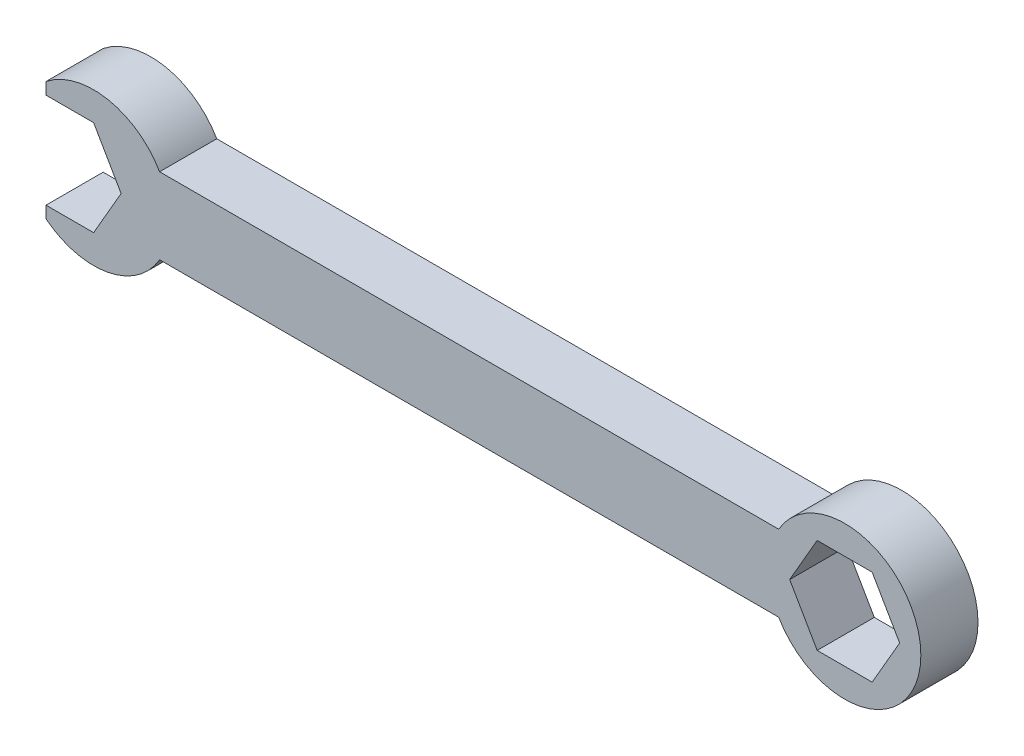
ISO-10303-21;
HEADER;
FILE_DESCRIPTION(('STEP AP214'),'2;1');
FILE_NAME('part.step','',(''),(''),'','','');
FILE_SCHEMA(('AUTOMOTIVE_DESIGN { 1 0 10303 214 1 1 1 1 }'));
ENDSEC;
DATA;
#1=APPLICATION_CONTEXT('core data for automotive mechanical design processes');
#2=APPLICATION_PROTOCOL_DEFINITION('international standard','automotive_design',2000,#1);
#3=PRODUCT_CONTEXT('',#1,'mechanical');
#4=PRODUCT('Part','Part','',(#3));
#5=PRODUCT_RELATED_PRODUCT_CATEGORY('part','',(#4));
#6=PRODUCT_DEFINITION_FORMATION('','',#4);
#7=PRODUCT_DEFINITION_CONTEXT('part definition',#1,'design');
#8=PRODUCT_DEFINITION('design','',#6,#7);
#9=PRODUCT_DEFINITION_SHAPE('','',#8);
#10=(LENGTH_UNIT() NAMED_UNIT(*) SI_UNIT(.MILLI.,.METRE.));
#11=(NAMED_UNIT(*) PLANE_ANGLE_UNIT() SI_UNIT($,.RADIAN.));
#12=(NAMED_UNIT(*) SI_UNIT($,.STERADIAN.) SOLID_ANGLE_UNIT());
#13=UNCERTAINTY_MEASURE_WITH_UNIT(LENGTH_MEASURE(1.E-05),#10,'distance_accuracy_value','');
#14=(GEOMETRIC_REPRESENTATION_CONTEXT(3) GLOBAL_UNCERTAINTY_ASSIGNED_CONTEXT((#13)) GLOBAL_UNIT_ASSIGNED_CONTEXT((#10,
#11,#12)) REPRESENTATION_CONTEXT('',''));
#15=CARTESIAN_POINT('',(0.,0.,0.));
#16=DIRECTION('',(0.,0.,1.));
#17=DIRECTION('',(1.,0.,0.));
#18=AXIS2_PLACEMENT_3D('',#15,#16,#17);
#19=CARTESIAN_POINT('',(77.8603578106905,-44.9526985412027,7.62));
#20=DIRECTION('',(-0.866025403784439,0.5,0.));
#21=DIRECTION('',(-0.5,-0.866025403784439,0.));
#22=AXIS2_PLACEMENT_3D('',#19,#20,#21);
#23=PLANE('',#22);
#24=DIRECTION('',(0.5,0.866025403784439,0.));
#25=VECTOR('',#24,1.);
#26=CARTESIAN_POINT('',(77.8603578106905,-44.9526985412027,0.));
#27=LINE('',#26,#25);
#28=CARTESIAN_POINT('',(100.1476362049,-6.34999999999999,0.));
#29=VERTEX_POINT('',#28);
#30=CARTESIAN_POINT('',(103.813810414254,0.,0.));
#31=VERTEX_POINT('',#30);
#32=EDGE_CURVE('E224',#29,#31,#27,.T.);
#33=ORIENTED_EDGE('',*,*,#32,.F.);
#34=DIRECTION('',(0.,0.,-1.));
#35=VECTOR('',#34,1.);
#36=CARTESIAN_POINT('',(100.1476362049,-6.34999999999999,7.62));
#37=LINE('',#36,#35);
#38=CARTESIAN_POINT('',(100.1476362049,-6.34999999999999,7.62));
#39=VERTEX_POINT('',#38);
#40=EDGE_CURVE('E11',#39,#29,#37,.T.);
#41=ORIENTED_EDGE('',*,*,#40,.F.);
#42=DIRECTION('',(0.5,0.866025403784439,0.));
#43=VECTOR('',#42,1.);
#44=CARTESIAN_POINT('',(77.8603578106905,-44.9526985412027,7.62));
#45=LINE('',#44,#43);
#46=CARTESIAN_POINT('',(103.813810414254,0.,7.62));
#47=VERTEX_POINT('',#46);
#48=EDGE_CURVE('E315',#39,#47,#45,.T.);
#49=ORIENTED_EDGE('',*,*,#48,.T.);
#50=DIRECTION('',(0.,0.,-1.));
#51=VECTOR('',#50,1.);
#52=CARTESIAN_POINT('',(103.813810414254,0.,7.62));
#53=LINE('',#52,#51);
#54=EDGE_CURVE('E59',#47,#31,#53,.T.);
#55=ORIENTED_EDGE('',*,*,#54,.T.);
#56=EDGE_LOOP('',(#33,#41,#49,#55));
#57=FACE_BOUND('',#56,.T.);
#58=ADVANCED_FACE('F39',(#57),#23,.T.);
#59=CARTESIAN_POINT('',(0.,-6.35,7.62));
#60=DIRECTION('',(0.,1.,0.));
#61=DIRECTION('',(-1.,0.,0.));
#62=AXIS2_PLACEMENT_3D('',#59,#60,#61);
#63=PLANE('',#62);
#64=DIRECTION('',(1.,0.,0.));
#65=VECTOR('',#64,1.);
#66=CARTESIAN_POINT('',(0.,-6.35,0.));
#67=LINE('',#66,#65);
#68=CARTESIAN_POINT('',(92.8152877861916,-6.34999999999999,0.));
#69=VERTEX_POINT('',#68);
#70=EDGE_CURVE('E230',#69,#29,#67,.T.);
#71=ORIENTED_EDGE('',*,*,#70,.F.);
#72=DIRECTION('',(0.,0.,-1.));
#73=VECTOR('',#72,1.);
#74=CARTESIAN_POINT('',(92.8152877861916,-6.34999999999999,7.62));
#75=LINE('',#74,#73);
#76=CARTESIAN_POINT('',(92.8152877861916,-6.34999999999999,7.62));
#77=VERTEX_POINT('',#76);
#78=EDGE_CURVE('E47',#77,#69,#75,.T.);
#79=ORIENTED_EDGE('',*,*,#78,.F.);
#80=DIRECTION('',(1.,0.,0.));
#81=VECTOR('',#80,1.);
#82=CARTESIAN_POINT('',(0.,-6.35,7.62));
#83=LINE('',#82,#81);
#84=EDGE_CURVE('E312',#77,#39,#83,.T.);
#85=ORIENTED_EDGE('',*,*,#84,.T.);
#86=ORIENTED_EDGE('',*,*,#40,.T.);
#87=EDGE_LOOP('',(#71,#79,#85,#86));
#88=FACE_BOUND('',#87,.T.);
#89=ADVANCED_FACE('F335',(#88),#63,.T.);
#90=CARTESIAN_POINT('',(66.8618351826281,38.6026985412027,7.62));
#91=DIRECTION('',(0.866025403784439,0.499999999999999,0.));
#92=DIRECTION('',(-0.5,0.866025403784439,0.));
#93=AXIS2_PLACEMENT_3D('',#90,#91,#92);
#94=PLANE('',#93);
#95=DIRECTION('',(0.499999999999999,-0.866025403784439,0.));
#96=VECTOR('',#95,1.);
#97=CARTESIAN_POINT('',(66.8618351826281,38.6026985412027,0.));
#98=LINE('',#97,#96);
#99=CARTESIAN_POINT('',(89.1491135768375,0.,0.));
#100=VERTEX_POINT('',#99);
#101=EDGE_CURVE('E229',#100,#69,#98,.T.);
#102=ORIENTED_EDGE('',*,*,#101,.F.);
#103=DIRECTION('',(0.,0.,-1.));
#104=VECTOR('',#103,1.);
#105=CARTESIAN_POINT('',(89.1491135768375,0.,7.62));
#106=LINE('',#105,#104);
#107=CARTESIAN_POINT('',(89.1491135768375,0.,7.62));
#108=VERTEX_POINT('',#107);
#109=EDGE_CURVE('E172',#108,#100,#106,.T.);
#110=ORIENTED_EDGE('',*,*,#109,.F.);
#111=DIRECTION('',(0.499999999999999,-0.866025403784439,0.));
#112=VECTOR('',#111,1.);
#113=CARTESIAN_POINT('',(66.8618351826281,38.6026985412027,7.62));
#114=LINE('',#113,#112);
#115=EDGE_CURVE('E186',#108,#77,#114,.T.);
#116=ORIENTED_EDGE('',*,*,#115,.T.);
#117=ORIENTED_EDGE('',*,*,#78,.T.);
#118=EDGE_LOOP('',(#102,#110,#116,#117));
#119=FACE_BOUND('',#118,.T.);
#120=ADVANCED_FACE('F318',(#119),#94,.T.);
#121=CARTESIAN_POINT('',(66.8618351826281,-38.6026985412027,7.62));
#122=DIRECTION('',(0.866025403784439,-0.5,0.));
#123=DIRECTION('',(0.5,0.866025403784439,0.));
#124=AXIS2_PLACEMENT_3D('',#121,#122,#123);
#125=PLANE('',#124);
#126=DIRECTION('',(-0.5,-0.866025403784439,0.));
#127=VECTOR('',#126,1.);
#128=CARTESIAN_POINT('',(66.8618351826281,-38.6026985412027,0.));
#129=LINE('',#128,#127);
#130=CARTESIAN_POINT('',(92.8152877861915,6.35000000000001,0.));
#131=VERTEX_POINT('',#130);
#132=EDGE_CURVE('E173',#131,#100,#129,.T.);
#133=ORIENTED_EDGE('',*,*,#132,.F.);
#134=DIRECTION('',(0.,0.,-1.));
#135=VECTOR('',#134,1.);
#136=CARTESIAN_POINT('',(92.8152877861915,6.35000000000001,7.62));
#137=LINE('',#136,#135);
#138=CARTESIAN_POINT('',(92.8152877861915,6.35000000000001,7.62));
#139=VERTEX_POINT('',#138);
#140=EDGE_CURVE('E168',#139,#131,#137,.T.);
#141=ORIENTED_EDGE('',*,*,#140,.F.);
#142=DIRECTION('',(-0.5,-0.866025403784439,0.));
#143=VECTOR('',#142,1.);
#144=CARTESIAN_POINT('',(66.8618351826281,-38.6026985412027,7.62));
#145=LINE('',#144,#143);
#146=EDGE_CURVE('E170',#139,#108,#145,.T.);
#147=ORIENTED_EDGE('',*,*,#146,.T.);
#148=ORIENTED_EDGE('',*,*,#109,.T.);
#149=EDGE_LOOP('',(#133,#141,#147,#148));
#150=FACE_BOUND('',#149,.T.);
#151=ADVANCED_FACE('F166',(#150),#125,.T.);
#152=CARTESIAN_POINT('',(0.,6.35000000000001,7.62));
#153=DIRECTION('',(0.,-1.,0.));
#154=DIRECTION('',(0.,0.,-1.));
#155=AXIS2_PLACEMENT_3D('',#152,#153,#154);
#156=PLANE('',#155);
#157=DIRECTION('',(-1.,0.,0.));
#158=VECTOR('',#157,1.);
#159=CARTESIAN_POINT('',(0.,6.35000000000001,0.));
#160=LINE('',#159,#158);
#161=CARTESIAN_POINT('',(100.1476362049,6.35,0.));
#162=VERTEX_POINT('',#161);
#163=EDGE_CURVE('E233',#162,#131,#160,.T.);
#164=ORIENTED_EDGE('',*,*,#163,.F.);
#165=DIRECTION('',(0.,0.,-1.));
#166=VECTOR('',#165,1.);
#167=CARTESIAN_POINT('',(100.1476362049,6.35,7.62));
#168=LINE('',#167,#166);
#169=CARTESIAN_POINT('',(100.1476362049,6.35,7.62));
#170=VERTEX_POINT('',#169);
#171=EDGE_CURVE('E110',#170,#162,#168,.T.);
#172=ORIENTED_EDGE('',*,*,#171,.F.);
#173=DIRECTION('',(-1.,0.,0.));
#174=VECTOR('',#173,1.);
#175=CARTESIAN_POINT('',(0.,6.35000000000001,7.62));
#176=LINE('',#175,#174);
#177=EDGE_CURVE('E183',#170,#139,#176,.T.);
#178=ORIENTED_EDGE('',*,*,#177,.T.);
#179=ORIENTED_EDGE('',*,*,#140,.T.);
#180=EDGE_LOOP('',(#164,#172,#178,#179));
#181=FACE_BOUND('',#180,.T.);
#182=ADVANCED_FACE('F187',(#181),#156,.T.);
#183=CARTESIAN_POINT('',(0.,-5.08,7.62));
#184=DIRECTION('',(0.,1.,0.));
#185=DIRECTION('',(0.,0.,1.));
#186=AXIS2_PLACEMENT_3D('',#183,#184,#185);
#187=PLANE('',#186);
#188=DIRECTION('',(1.,0.,0.));
#189=VECTOR('',#188,1.);
#190=CARTESIAN_POINT('',(0.,-5.08,0.));
#191=LINE('',#190,#189);
#192=CARTESIAN_POINT('',(5.13264389309577,-5.08,0.));
#193=VERTEX_POINT('',#192);
#194=CARTESIAN_POINT('',(87.6826438930958,-5.08,0.));
#195=VERTEX_POINT('',#194);
#196=EDGE_CURVE('E193',#193,#195,#191,.T.);
#197=ORIENTED_EDGE('',*,*,#196,.T.);
#198=DIRECTION('',(0.,0.,-1.));
#199=VECTOR('',#198,1.);
#200=CARTESIAN_POINT('',(87.6826438930958,-5.08,7.62));
#201=LINE('',#200,#199);
#202=CARTESIAN_POINT('',(87.6826438930958,-5.08,7.62));
#203=VERTEX_POINT('',#202);
#204=EDGE_CURVE('E43',#203,#195,#201,.T.);
#205=ORIENTED_EDGE('',*,*,#204,.F.);
#206=DIRECTION('',(1.,0.,0.));
#207=VECTOR('',#206,1.);
#208=CARTESIAN_POINT('',(0.,-5.08,7.62));
#209=LINE('',#208,#207);
#210=CARTESIAN_POINT('',(5.13264389309577,-5.08,7.62));
#211=VERTEX_POINT('',#210);
#212=EDGE_CURVE('E236',#211,#203,#209,.T.);
#213=ORIENTED_EDGE('',*,*,#212,.F.);
#214=DIRECTION('',(0.,0.,-1.));
#215=VECTOR('',#214,1.);
#216=CARTESIAN_POINT('',(5.13264389309577,-5.08,7.62));
#217=LINE('',#216,#215);
#218=EDGE_CURVE('E192',#211,#193,#217,.T.);
#219=ORIENTED_EDGE('',*,*,#218,.T.);
#220=EDGE_LOOP('',(#197,#205,#213,#219));
#221=FACE_BOUND('',#220,.T.);
#222=ADVANCED_FACE('F41',(#221),#187,.F.);
#223=CARTESIAN_POINT('',(96.4814619955457,0.,7.62));
#224=DIRECTION('',(0.,0.,-1.));
#225=DIRECTION('',(-1.,0.,0.));
#226=AXIS2_PLACEMENT_3D('',#223,#224,#225);
#227=CYLINDRICAL_SURFACE('',#226,10.16);
#228=CARTESIAN_POINT('',(96.4814619955457,0.,0.));
#229=DIRECTION('',(0.,0.,1.));
#230=DIRECTION('',(1.,0.,0.));
#231=AXIS2_PLACEMENT_3D('',#228,#229,#230);
#232=CIRCLE('',#231,10.16);
#233=CARTESIAN_POINT('',(87.6826438930958,5.08,0.));
#234=VERTEX_POINT('',#233);
#235=EDGE_CURVE('E199',#195,#234,#232,.T.);
#236=ORIENTED_EDGE('',*,*,#235,.T.);
#237=DIRECTION('',(0.,0.,-1.));
#238=VECTOR('',#237,1.);
#239=CARTESIAN_POINT('',(87.6826438930958,5.08,7.62));
#240=LINE('',#239,#238);
#241=CARTESIAN_POINT('',(87.6826438930958,5.08,7.62));
#242=VERTEX_POINT('',#241);
#243=EDGE_CURVE('E265',#242,#234,#240,.T.);
#244=ORIENTED_EDGE('',*,*,#243,.F.);
#245=CARTESIAN_POINT('',(96.4814619955457,0.,7.62));
#246=DIRECTION('',(0.,0.,1.));
#247=DIRECTION('',(1.,0.,0.));
#248=AXIS2_PLACEMENT_3D('',#245,#246,#247);
#249=CIRCLE('',#248,10.16);
#250=EDGE_CURVE('E121',#203,#242,#249,.T.);
#251=ORIENTED_EDGE('',*,*,#250,.F.);
#252=ORIENTED_EDGE('',*,*,#204,.T.);
#253=EDGE_LOOP('',(#236,#244,#251,#252));
#254=FACE_BOUND('',#253,.T.);
#255=ADVANCED_FACE('F270',(#254),#227,.T.);
#256=CARTESIAN_POINT('',(0.,5.08,7.62));
#257=DIRECTION('',(0.,1.,0.));
#258=DIRECTION('',(0.,0.,1.));
#259=AXIS2_PLACEMENT_3D('',#256,#257,#258);
#260=PLANE('',#259);
#261=DIRECTION('',(1.,0.,0.));
#262=VECTOR('',#261,1.);
#263=CARTESIAN_POINT('',(0.,5.08,0.));
#264=LINE('',#263,#262);
#265=CARTESIAN_POINT('',(5.13264389309577,5.08,0.));
#266=VERTEX_POINT('',#265);
#267=EDGE_CURVE('E202',#266,#234,#264,.T.);
#268=ORIENTED_EDGE('',*,*,#267,.F.);
#269=DIRECTION('',(0.,0.,-1.));
#270=VECTOR('',#269,1.);
#271=CARTESIAN_POINT('',(5.13264389309577,5.08,7.62));
#272=LINE('',#271,#270);
#273=CARTESIAN_POINT('',(5.13264389309577,5.08,7.62));
#274=VERTEX_POINT('',#273);
#275=EDGE_CURVE('E263',#274,#266,#272,.T.);
#276=ORIENTED_EDGE('',*,*,#275,.F.);
#277=DIRECTION('',(1.,0.,0.));
#278=VECTOR('',#277,1.);
#279=CARTESIAN_POINT('',(0.,5.08,7.62));
#280=LINE('',#279,#278);
#281=EDGE_CURVE('E285',#274,#242,#280,.T.);
#282=ORIENTED_EDGE('',*,*,#281,.T.);
#283=ORIENTED_EDGE('',*,*,#243,.T.);
#284=EDGE_LOOP('',(#268,#276,#282,#283));
#285=FACE_BOUND('',#284,.T.);
#286=ADVANCED_FACE('F278',(#285),#260,.T.);
#287=CARTESIAN_POINT('',(-3.66617420935412,0.,7.62));
#288=DIRECTION('',(0.,0.,-1.));
#289=DIRECTION('',(-1.,0.,0.));
#290=AXIS2_PLACEMENT_3D('',#287,#288,#289);
#291=CYLINDRICAL_SURFACE('',#290,10.16);
#292=CARTESIAN_POINT('',(-3.66617420935412,0.,0.));
#293=DIRECTION('',(0.,0.,1.));
#294=DIRECTION('',(1.,0.,0.));
#295=AXIS2_PLACEMENT_3D('',#292,#293,#294);
#296=CIRCLE('',#295,10.16);
#297=CARTESIAN_POINT('',(-10.0161742093541,7.93114745796596,0.));
#298=VERTEX_POINT('',#297);
#299=EDGE_CURVE('E204',#266,#298,#296,.T.);
#300=ORIENTED_EDGE('',*,*,#299,.T.);
#301=DIRECTION('',(0.,0.,-1.));
#302=VECTOR('',#301,1.);
#303=CARTESIAN_POINT('',(-10.0161742093541,7.93114745796596,7.62));
#304=LINE('',#303,#302);
#305=CARTESIAN_POINT('',(-10.0161742093541,7.93114745796596,7.62));
#306=VERTEX_POINT('',#305);
#307=EDGE_CURVE('E256',#306,#298,#304,.T.);
#308=ORIENTED_EDGE('',*,*,#307,.F.);
#309=CARTESIAN_POINT('',(-3.66617420935412,0.,7.62));
#310=DIRECTION('',(0.,0.,1.));
#311=DIRECTION('',(1.,0.,0.));
#312=AXIS2_PLACEMENT_3D('',#309,#310,#311);
#313=CIRCLE('',#312,10.16);
#314=EDGE_CURVE('E283',#274,#306,#313,.T.);
#315=ORIENTED_EDGE('',*,*,#314,.F.);
#316=ORIENTED_EDGE('',*,*,#275,.T.);
#317=EDGE_LOOP('',(#300,#308,#315,#316));
#318=FACE_BOUND('',#317,.T.);
#319=ADVANCED_FACE('F286',(#318),#291,.T.);
#320=CARTESIAN_POINT('',(-10.0161742093541,0.,7.62));
#321=DIRECTION('',(1.,0.,0.));
#322=DIRECTION('',(0.,0.,-1.));
#323=AXIS2_PLACEMENT_3D('',#320,#321,#322);
#324=PLANE('',#323);
#325=DIRECTION('',(0.,-1.,0.));
#326=VECTOR('',#325,1.);
#327=CARTESIAN_POINT('',(-10.0161742093541,0.,0.));
#328=LINE('',#327,#326);
#329=CARTESIAN_POINT('',(-10.0161742093541,6.35,0.));
#330=VERTEX_POINT('',#329);
#331=EDGE_CURVE('E206',#298,#330,#328,.T.);
#332=ORIENTED_EDGE('',*,*,#331,.T.);
#333=DIRECTION('',(0.,0.,-1.));
#334=VECTOR('',#333,1.);
#335=CARTESIAN_POINT('',(-10.0161742093541,6.35,7.62));
#336=LINE('',#335,#334);
#337=CARTESIAN_POINT('',(-10.0161742093541,6.35,7.62));
#338=VERTEX_POINT('',#337);
#339=EDGE_CURVE('E258',#338,#330,#336,.T.);
#340=ORIENTED_EDGE('',*,*,#339,.F.);
#341=DIRECTION('',(0.,-1.,0.));
#342=VECTOR('',#341,1.);
#343=CARTESIAN_POINT('',(-10.0161742093541,0.,7.62));
#344=LINE('',#343,#342);
#345=EDGE_CURVE('E288',#306,#338,#344,.T.);
#346=ORIENTED_EDGE('',*,*,#345,.F.);
#347=ORIENTED_EDGE('',*,*,#307,.T.);
#348=EDGE_LOOP('',(#332,#340,#346,#347));
#349=FACE_BOUND('',#348,.T.);
#350=ADVANCED_FACE('F365',(#349),#324,.F.);
#351=CARTESIAN_POINT('',(0.,6.35,7.62));
#352=DIRECTION('',(0.,-1.,0.));
#353=DIRECTION('',(0.,0.,-1.));
#354=AXIS2_PLACEMENT_3D('',#351,#352,#353);
#355=PLANE('',#354);
#356=DIRECTION('',(-1.,0.,0.));
#357=VECTOR('',#356,1.);
#358=CARTESIAN_POINT('',(0.,6.35,0.));
#359=LINE('',#358,#357);
#360=CARTESIAN_POINT('',(-3.66617420935412,6.35,0.));
#361=VERTEX_POINT('',#360);
#362=EDGE_CURVE('E210',#361,#330,#359,.T.);
#363=ORIENTED_EDGE('',*,*,#362,.F.);
#364=DIRECTION('',(0.,0.,-1.));
#365=VECTOR('',#364,1.);
#366=CARTESIAN_POINT('',(-3.66617420935412,6.35,7.62));
#367=LINE('',#366,#365);
#368=CARTESIAN_POINT('',(-3.66617420935412,6.35,7.62));
#369=VERTEX_POINT('',#368);
#370=EDGE_CURVE('E253',#369,#361,#367,.T.);
#371=ORIENTED_EDGE('',*,*,#370,.F.);
#372=DIRECTION('',(-1.,0.,0.));
#373=VECTOR('',#372,1.);
#374=CARTESIAN_POINT('',(0.,6.35,7.62));
#375=LINE('',#374,#373);
#376=EDGE_CURVE('E297',#369,#338,#375,.T.);
#377=ORIENTED_EDGE('',*,*,#376,.T.);
#378=ORIENTED_EDGE('',*,*,#339,.T.);
#379=EDGE_LOOP('',(#363,#371,#377,#378));
#380=FACE_BOUND('',#379,.T.);
#381=ADVANCED_FACE('F358',(#380),#355,.T.);
#382=CARTESIAN_POINT('',(0.,0.,7.62));
#383=DIRECTION('',(-0.866025403784439,-0.5,0.));
#384=DIRECTION('',(0.5,-0.866025403784439,0.));
#385=AXIS2_PLACEMENT_3D('',#382,#383,#384);
#386=PLANE('',#385);
#387=DIRECTION('',(-0.5,0.866025403784439,0.));
#388=VECTOR('',#387,1.);
#389=CARTESIAN_POINT('',(0.,0.,0.));
#390=LINE('',#389,#388);
#391=CARTESIAN_POINT('',(0.,0.,0.));
#392=VERTEX_POINT('',#391);
#393=EDGE_CURVE('E211',#392,#361,#390,.T.);
#394=ORIENTED_EDGE('',*,*,#393,.F.);
#395=DIRECTION('',(0.,0.,-1.));
#396=VECTOR('',#395,1.);
#397=CARTESIAN_POINT('',(0.,0.,7.62));
#398=LINE('',#397,#396);
#399=CARTESIAN_POINT('',(0.,0.,7.62));
#400=VERTEX_POINT('',#399);
#401=EDGE_CURVE('E252',#400,#392,#398,.T.);
#402=ORIENTED_EDGE('',*,*,#401,.F.);
#403=DIRECTION('',(-0.5,0.866025403784439,0.));
#404=VECTOR('',#403,1.);
#405=CARTESIAN_POINT('',(0.,0.,7.62));
#406=LINE('',#405,#404);
#407=EDGE_CURVE('E300',#400,#369,#406,.T.);
#408=ORIENTED_EDGE('',*,*,#407,.T.);
#409=ORIENTED_EDGE('',*,*,#370,.T.);
#410=EDGE_LOOP('',(#394,#402,#408,#409));
#411=FACE_BOUND('',#410,.T.);
#412=ADVANCED_FACE('F354',(#411),#386,.T.);
#413=CARTESIAN_POINT('',(0.,0.,7.62));
#414=DIRECTION('',(-0.866025403784439,0.5,0.));
#415=DIRECTION('',(-0.5,-0.866025403784439,0.));
#416=AXIS2_PLACEMENT_3D('',#413,#414,#415);
#417=PLANE('',#416);
#418=DIRECTION('',(0.5,0.866025403784439,0.));
#419=VECTOR('',#418,1.);
#420=CARTESIAN_POINT('',(0.,0.,0.));
#421=LINE('',#420,#419);
#422=CARTESIAN_POINT('',(-3.66617420935412,-6.35,0.));
#423=VERTEX_POINT('',#422);
#424=EDGE_CURVE('E218',#423,#392,#421,.T.);
#425=ORIENTED_EDGE('',*,*,#424,.F.);
#426=DIRECTION('',(0.,0.,-1.));
#427=VECTOR('',#426,1.);
#428=CARTESIAN_POINT('',(-3.66617420935412,-6.35,7.62));
#429=LINE('',#428,#427);
#430=CARTESIAN_POINT('',(-3.66617420935412,-6.35,7.62));
#431=VERTEX_POINT('',#430);
#432=EDGE_CURVE('E248',#431,#423,#429,.T.);
#433=ORIENTED_EDGE('',*,*,#432,.F.);
#434=DIRECTION('',(0.5,0.866025403784439,0.));
#435=VECTOR('',#434,1.);
#436=CARTESIAN_POINT('',(0.,0.,7.62));
#437=LINE('',#436,#435);
#438=EDGE_CURVE('E301',#431,#400,#437,.T.);
#439=ORIENTED_EDGE('',*,*,#438,.T.);
#440=ORIENTED_EDGE('',*,*,#401,.T.);
#441=EDGE_LOOP('',(#425,#433,#439,#440));
#442=FACE_BOUND('',#441,.T.);
#443=ADVANCED_FACE('F349',(#442),#417,.T.);
#444=CARTESIAN_POINT('',(0.,-6.35,7.62));
#445=DIRECTION('',(0.,1.,0.));
#446=DIRECTION('',(0.,0.,1.));
#447=AXIS2_PLACEMENT_3D('',#444,#445,#446);
#448=PLANE('',#447);
#449=DIRECTION('',(1.,0.,0.));
#450=VECTOR('',#449,1.);
#451=CARTESIAN_POINT('',(0.,-6.35,0.));
#452=LINE('',#451,#450);
#453=CARTESIAN_POINT('',(-10.0161742093541,-6.35,0.));
#454=VERTEX_POINT('',#453);
#455=EDGE_CURVE('E219',#454,#423,#452,.T.);
#456=ORIENTED_EDGE('',*,*,#455,.F.);
#457=DIRECTION('',(0.,0.,-1.));
#458=VECTOR('',#457,1.);
#459=CARTESIAN_POINT('',(-10.0161742093541,-6.35,7.62));
#460=LINE('',#459,#458);
#461=CARTESIAN_POINT('',(-10.0161742093541,-6.35,7.62));
#462=VERTEX_POINT('',#461);
#463=EDGE_CURVE('E246',#462,#454,#460,.T.);
#464=ORIENTED_EDGE('',*,*,#463,.F.);
#465=DIRECTION('',(1.,0.,0.));
#466=VECTOR('',#465,1.);
#467=CARTESIAN_POINT('',(0.,-6.35,7.62));
#468=LINE('',#467,#466);
#469=EDGE_CURVE('E308',#462,#431,#468,.T.);
#470=ORIENTED_EDGE('',*,*,#469,.T.);
#471=ORIENTED_EDGE('',*,*,#432,.T.);
#472=EDGE_LOOP('',(#456,#464,#470,#471));
#473=FACE_BOUND('',#472,.T.);
#474=ADVANCED_FACE('F348',(#473),#448,.T.);
#475=CARTESIAN_POINT('',(-10.0161742093541,0.,7.62));
#476=DIRECTION('',(-1.,0.,0.));
#477=DIRECTION('',(0.,0.,1.));
#478=AXIS2_PLACEMENT_3D('',#475,#476,#477);
#479=PLANE('',#478);
#480=DIRECTION('',(0.,1.,0.));
#481=VECTOR('',#480,1.);
#482=CARTESIAN_POINT('',(-10.0161742093541,0.,0.));
#483=LINE('',#482,#481);
#484=CARTESIAN_POINT('',(-10.0161742093541,-7.93114745796597,0.));
#485=VERTEX_POINT('',#484);
#486=EDGE_CURVE('E225',#485,#454,#483,.T.);
#487=ORIENTED_EDGE('',*,*,#486,.F.);
#488=DIRECTION('',(0.,0.,-1.));
#489=VECTOR('',#488,1.);
#490=CARTESIAN_POINT('',(-10.0161742093541,-7.93114745796597,7.62));
#491=LINE('',#490,#489);
#492=CARTESIAN_POINT('',(-10.0161742093541,-7.93114745796597,7.62));
#493=VERTEX_POINT('',#492);
#494=EDGE_CURVE('E247',#493,#485,#491,.T.);
#495=ORIENTED_EDGE('',*,*,#494,.F.);
#496=DIRECTION('',(0.,1.,0.));
#497=VECTOR('',#496,1.);
#498=CARTESIAN_POINT('',(-10.0161742093541,0.,7.62));
#499=LINE('',#498,#497);
#500=EDGE_CURVE('E309',#493,#462,#499,.T.);
#501=ORIENTED_EDGE('',*,*,#500,.T.);
#502=ORIENTED_EDGE('',*,*,#463,.T.);
#503=EDGE_LOOP('',(#487,#495,#501,#502));
#504=FACE_BOUND('',#503,.T.);
#505=ADVANCED_FACE('F326',(#504),#479,.T.);
#506=EDGE_CURVE('E207',#485,#193,#296,.T.);
#507=ORIENTED_EDGE('',*,*,#506,.T.);
#508=ORIENTED_EDGE('',*,*,#218,.F.);
#509=EDGE_CURVE('E292',#493,#211,#313,.T.);
#510=ORIENTED_EDGE('',*,*,#509,.F.);
#511=ORIENTED_EDGE('',*,*,#494,.T.);
#512=EDGE_LOOP('',(#507,#508,#510,#511));
#513=FACE_BOUND('',#512,.T.);
#514=ADVANCED_FACE('F325',(#513),#291,.T.);
#515=CARTESIAN_POINT('',(77.8603578106905,44.9526985412027,7.62));
#516=DIRECTION('',(-0.866025403784439,-0.5,0.));
#517=DIRECTION('',(0.5,-0.866025403784439,0.));
#518=AXIS2_PLACEMENT_3D('',#515,#516,#517);
#519=PLANE('',#518);
#520=DIRECTION('',(-0.5,0.866025403784439,0.));
#521=VECTOR('',#520,1.);
#522=CARTESIAN_POINT('',(77.8603578106905,44.9526985412027,0.));
#523=LINE('',#522,#521);
#524=EDGE_CURVE('E237',#31,#162,#523,.T.);
#525=ORIENTED_EDGE('',*,*,#524,.F.);
#526=ORIENTED_EDGE('',*,*,#54,.F.);
#527=DIRECTION('',(-0.5,0.866025403784439,0.));
#528=VECTOR('',#527,1.);
#529=CARTESIAN_POINT('',(77.8603578106905,44.9526985412027,7.62));
#530=LINE('',#529,#528);
#531=EDGE_CURVE('E188',#47,#170,#530,.T.);
#532=ORIENTED_EDGE('',*,*,#531,.T.);
#533=ORIENTED_EDGE('',*,*,#171,.T.);
#534=EDGE_LOOP('',(#525,#526,#532,#533));
#535=FACE_BOUND('',#534,.T.);
#536=ADVANCED_FACE('F319',(#535),#519,.T.);
#537=CARTESIAN_POINT('',(0.,0.,7.62));
#538=DIRECTION('',(0.,0.,1.));
#539=DIRECTION('',(1.,0.,0.));
#540=AXIS2_PLACEMENT_3D('',#537,#538,#539);
#541=PLANE('',#540);
#542=ORIENTED_EDGE('',*,*,#212,.T.);
#543=ORIENTED_EDGE('',*,*,#250,.T.);
#544=ORIENTED_EDGE('',*,*,#281,.F.);
#545=ORIENTED_EDGE('',*,*,#314,.T.);
#546=ORIENTED_EDGE('',*,*,#345,.T.);
#547=ORIENTED_EDGE('',*,*,#376,.F.);
#548=ORIENTED_EDGE('',*,*,#407,.F.);
#549=ORIENTED_EDGE('',*,*,#438,.F.);
#550=ORIENTED_EDGE('',*,*,#469,.F.);
#551=ORIENTED_EDGE('',*,*,#500,.F.);
#552=ORIENTED_EDGE('',*,*,#509,.T.);
#553=EDGE_LOOP('',(#542,#543,#544,#545,#546,#547,#548,#549,#550,#551,#552));
#554=FACE_BOUND('',#553,.T.);
#555=ORIENTED_EDGE('',*,*,#48,.F.);
#556=ORIENTED_EDGE('',*,*,#84,.F.);
#557=ORIENTED_EDGE('',*,*,#115,.F.);
#558=ORIENTED_EDGE('',*,*,#146,.F.);
#559=ORIENTED_EDGE('',*,*,#177,.F.);
#560=ORIENTED_EDGE('',*,*,#531,.F.);
#561=EDGE_LOOP('',(#555,#556,#557,#558,#559,#560));
#562=FACE_BOUND('',#561,.T.);
#563=ADVANCED_FACE('F181',(#554,#562),#541,.T.);
#564=CARTESIAN_POINT('',(0.,0.,0.));
#565=DIRECTION('',(0.,0.,1.));
#566=DIRECTION('',(1.,0.,0.));
#567=AXIS2_PLACEMENT_3D('',#564,#565,#566);
#568=PLANE('',#567);
#569=ORIENTED_EDGE('',*,*,#196,.F.);
#570=ORIENTED_EDGE('',*,*,#506,.F.);
#571=ORIENTED_EDGE('',*,*,#486,.T.);
#572=ORIENTED_EDGE('',*,*,#455,.T.);
#573=ORIENTED_EDGE('',*,*,#424,.T.);
#574=ORIENTED_EDGE('',*,*,#393,.T.);
#575=ORIENTED_EDGE('',*,*,#362,.T.);
#576=ORIENTED_EDGE('',*,*,#331,.F.);
#577=ORIENTED_EDGE('',*,*,#299,.F.);
#578=ORIENTED_EDGE('',*,*,#267,.T.);
#579=ORIENTED_EDGE('',*,*,#235,.F.);
#580=EDGE_LOOP('',(#569,#570,#571,#572,#573,#574,#575,#576,#577,#578,#579));
#581=FACE_BOUND('',#580,.T.);
#582=ORIENTED_EDGE('',*,*,#32,.T.);
#583=ORIENTED_EDGE('',*,*,#524,.T.);
#584=ORIENTED_EDGE('',*,*,#163,.T.);
#585=ORIENTED_EDGE('',*,*,#132,.T.);
#586=ORIENTED_EDGE('',*,*,#101,.T.);
#587=ORIENTED_EDGE('',*,*,#70,.T.);
#588=EDGE_LOOP('',(#582,#583,#584,#585,#586,#587));
#589=FACE_BOUND('',#588,.T.);
#590=ADVANCED_FACE('F272',(#581,#589),#568,.F.);
#591=CLOSED_SHELL('',(#58,#89,#120,#151,#182,#222,#255,#286,#319,#350,#381,#412,#443,#474,#505,
#514,#536,#563,#590));
#592=MANIFOLD_SOLID_BREP('B2',#591);
#593=ADVANCED_BREP_SHAPE_REPRESENTATION('',(#18,#592),#14);
#594=SHAPE_DEFINITION_REPRESENTATION(#9,#593);
ENDSEC;
END-ISO-10303-21;
